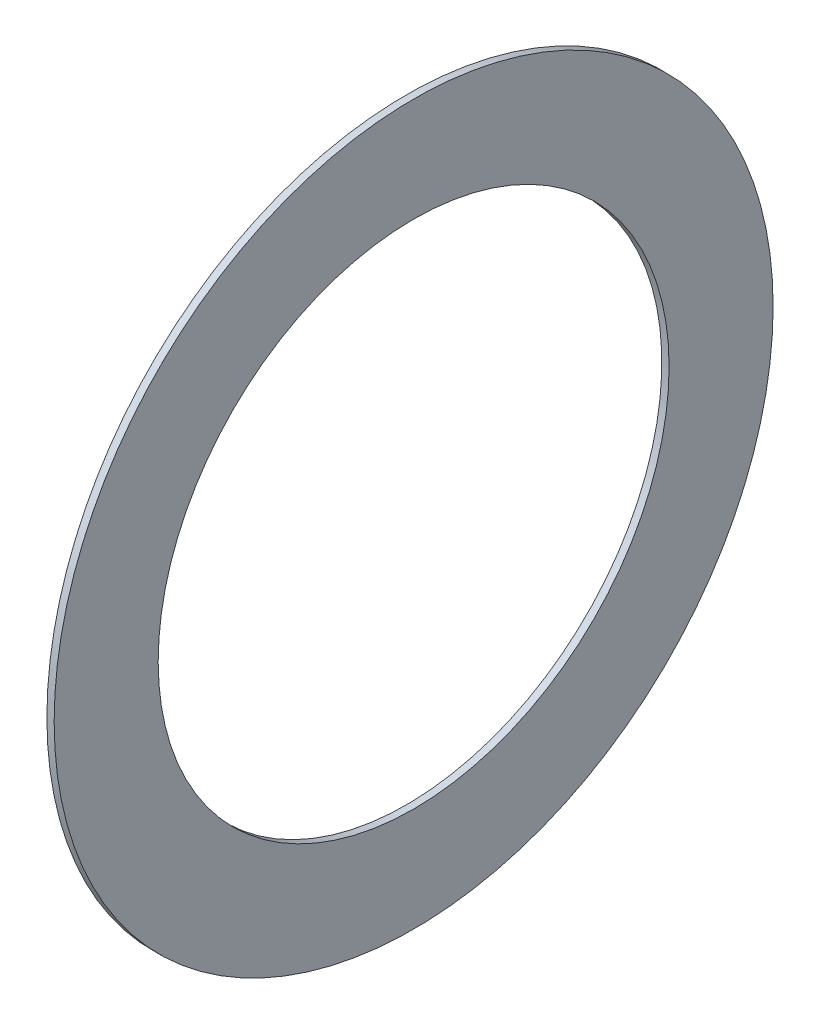
ISO-10303-21;
HEADER;
FILE_DESCRIPTION(('STEP AP214'),'2;1');
FILE_NAME('part.step','',(''),(''),'','','');
FILE_SCHEMA(('AUTOMOTIVE_DESIGN { 1 0 10303 214 1 1 1 1 }'));
ENDSEC;
DATA;
#1=APPLICATION_CONTEXT('core data for automotive mechanical design processes');
#2=APPLICATION_PROTOCOL_DEFINITION('international standard','automotive_design',2000,#1);
#3=PRODUCT_CONTEXT('',#1,'mechanical');
#4=PRODUCT('Part','Part','',(#3));
#5=PRODUCT_RELATED_PRODUCT_CATEGORY('part','',(#4));
#6=PRODUCT_DEFINITION_FORMATION('','',#4);
#7=PRODUCT_DEFINITION_CONTEXT('part definition',#1,'design');
#8=PRODUCT_DEFINITION('design','',#6,#7);
#9=PRODUCT_DEFINITION_SHAPE('','',#8);
#10=(LENGTH_UNIT() NAMED_UNIT(*) SI_UNIT(.MILLI.,.METRE.));
#11=(NAMED_UNIT(*) PLANE_ANGLE_UNIT() SI_UNIT($,.RADIAN.));
#12=(NAMED_UNIT(*) SI_UNIT($,.STERADIAN.) SOLID_ANGLE_UNIT());
#13=UNCERTAINTY_MEASURE_WITH_UNIT(LENGTH_MEASURE(1.E-05),#10,'distance_accuracy_value','');
#14=(GEOMETRIC_REPRESENTATION_CONTEXT(3) GLOBAL_UNCERTAINTY_ASSIGNED_CONTEXT((#13)) GLOBAL_UNIT_ASSIGNED_CONTEXT((#10,
#11,#12)) REPRESENTATION_CONTEXT('',''));
#15=CARTESIAN_POINT('',(0.,0.,0.));
#16=DIRECTION('',(0.,0.,1.));
#17=DIRECTION('',(1.,0.,0.));
#18=AXIS2_PLACEMENT_3D('',#15,#16,#17);
#19=CARTESIAN_POINT('',(0.,-27.8071341841781,-27.3));
#20=DIRECTION('',(-1.,0.,0.));
#21=DIRECTION('',(0.,0.,1.));
#22=AXIS2_PLACEMENT_3D('',#19,#20,#21);
#23=PLANE('',#22);
#24=CARTESIAN_POINT('',(0.,0.,0.));
#25=DIRECTION('',(-1.,0.,0.));
#26=DIRECTION('',(0.,0.,-1.));
#27=AXIS2_PLACEMENT_3D('',#24,#25,#26);
#28=CIRCLE('',#27,27.3);
#29=CARTESIAN_POINT('',(0.,0.,-27.3));
#30=VERTEX_POINT('',#29);
#31=EDGE_CURVE('E29',#30,#30,#28,.F.);
#32=ORIENTED_EDGE('',*,*,#31,.F.);
#33=EDGE_LOOP('',(#32));
#34=FACE_BOUND('',#33,.T.);
#35=CARTESIAN_POINT('',(0.,0.,0.));
#36=DIRECTION('',(1.,0.,0.));
#37=DIRECTION('',(0.,0.,1.));
#38=AXIS2_PLACEMENT_3D('',#35,#36,#37);
#39=CIRCLE('',#38,19.4);
#40=CARTESIAN_POINT('',(0.,0.,19.4));
#41=VERTEX_POINT('',#40);
#42=EDGE_CURVE('E25',#41,#41,#39,.T.);
#43=ORIENTED_EDGE('',*,*,#42,.T.);
#44=EDGE_LOOP('',(#43));
#45=FACE_BOUND('',#44,.T.);
#46=ADVANCED_FACE('F14',(#34,#45),#23,.T.);
#47=CARTESIAN_POINT('',(0.552,-27.8071341841781,27.3));
#48=DIRECTION('',(1.,0.,0.));
#49=DIRECTION('',(0.,0.,-1.));
#50=AXIS2_PLACEMENT_3D('',#47,#48,#49);
#51=PLANE('',#50);
#52=CARTESIAN_POINT('',(0.552,0.,0.));
#53=DIRECTION('',(1.,0.,0.));
#54=DIRECTION('',(0.,0.,1.));
#55=AXIS2_PLACEMENT_3D('',#52,#53,#54);
#56=CIRCLE('',#55,27.3);
#57=CARTESIAN_POINT('',(0.552,0.,27.3));
#58=VERTEX_POINT('',#57);
#59=EDGE_CURVE('E21',#58,#58,#56,.T.);
#60=ORIENTED_EDGE('',*,*,#59,.T.);
#61=EDGE_LOOP('',(#60));
#62=FACE_BOUND('',#61,.T.);
#63=CARTESIAN_POINT('',(0.552,0.,0.));
#64=DIRECTION('',(-1.,0.,0.));
#65=DIRECTION('',(0.,0.,-1.));
#66=AXIS2_PLACEMENT_3D('',#63,#64,#65);
#67=CIRCLE('',#66,19.4);
#68=CARTESIAN_POINT('',(0.552,0.,-19.4));
#69=VERTEX_POINT('',#68);
#70=EDGE_CURVE('E9',#69,#69,#67,.F.);
#71=ORIENTED_EDGE('',*,*,#70,.F.);
#72=EDGE_LOOP('',(#71));
#73=FACE_BOUND('',#72,.T.);
#74=ADVANCED_FACE('F39',(#62,#73),#51,.T.);
#75=CARTESIAN_POINT('',(0.552,0.,0.));
#76=DIRECTION('',(1.,0.,0.));
#77=DIRECTION('',(0.,0.,1.));
#78=AXIS2_PLACEMENT_3D('',#75,#76,#77);
#79=CYLINDRICAL_SURFACE('',#78,19.4);
#80=ORIENTED_EDGE('',*,*,#70,.T.);
#81=EDGE_LOOP('',(#80));
#82=FACE_BOUND('',#81,.T.);
#83=ORIENTED_EDGE('',*,*,#42,.F.);
#84=EDGE_LOOP('',(#83));
#85=FACE_BOUND('',#84,.T.);
#86=ADVANCED_FACE('F43',(#82,#85),#79,.F.);
#87=CARTESIAN_POINT('',(0.552,0.,0.));
#88=DIRECTION('',(1.,0.,0.));
#89=DIRECTION('',(0.,0.,1.));
#90=AXIS2_PLACEMENT_3D('',#87,#88,#89);
#91=CYLINDRICAL_SURFACE('',#90,27.3);
#92=ORIENTED_EDGE('',*,*,#31,.T.);
#93=EDGE_LOOP('',(#92));
#94=FACE_BOUND('',#93,.T.);
#95=ORIENTED_EDGE('',*,*,#59,.F.);
#96=EDGE_LOOP('',(#95));
#97=FACE_BOUND('',#96,.T.);
#98=ADVANCED_FACE('F16',(#94,#97),#91,.T.);
#99=CLOSED_SHELL('',(#46,#74,#86,#98));
#100=MANIFOLD_SOLID_BREP('B1',#99);
#101=ADVANCED_BREP_SHAPE_REPRESENTATION('',(#18,#100),#14);
#102=SHAPE_DEFINITION_REPRESENTATION(#9,#101);
ENDSEC;
END-ISO-10303-21;
